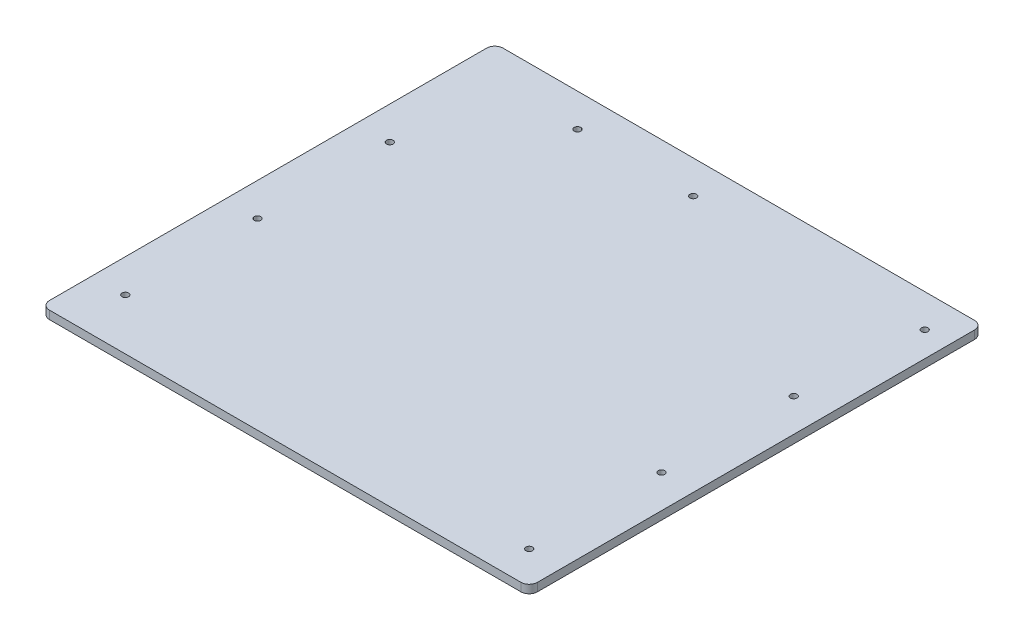
ISO-10303-21;
HEADER;
FILE_DESCRIPTION(('STEP AP214'),'2;1');
FILE_NAME('part.step','',(''),(''),'','','');
FILE_SCHEMA(('AUTOMOTIVE_DESIGN { 1 0 10303 214 1 1 1 1 }'));
ENDSEC;
DATA;
#1=APPLICATION_CONTEXT('core data for automotive mechanical design processes');
#2=APPLICATION_PROTOCOL_DEFINITION('international standard','automotive_design',2000,#1);
#3=PRODUCT_CONTEXT('',#1,'mechanical');
#4=PRODUCT('Part','Part','',(#3));
#5=PRODUCT_RELATED_PRODUCT_CATEGORY('part','',(#4));
#6=PRODUCT_DEFINITION_FORMATION('','',#4);
#7=PRODUCT_DEFINITION_CONTEXT('part definition',#1,'design');
#8=PRODUCT_DEFINITION('design','',#6,#7);
#9=PRODUCT_DEFINITION_SHAPE('','',#8);
#10=(LENGTH_UNIT() NAMED_UNIT(*) SI_UNIT(.MILLI.,.METRE.));
#11=(NAMED_UNIT(*) PLANE_ANGLE_UNIT() SI_UNIT($,.RADIAN.));
#12=(NAMED_UNIT(*) SI_UNIT($,.STERADIAN.) SOLID_ANGLE_UNIT());
#13=UNCERTAINTY_MEASURE_WITH_UNIT(LENGTH_MEASURE(1.E-05),#10,'distance_accuracy_value','');
#14=(GEOMETRIC_REPRESENTATION_CONTEXT(3) GLOBAL_UNCERTAINTY_ASSIGNED_CONTEXT((#13)) GLOBAL_UNIT_ASSIGNED_CONTEXT((#10,
#11,#12)) REPRESENTATION_CONTEXT('',''));
#15=CARTESIAN_POINT('',(0.,0.,0.));
#16=DIRECTION('',(0.,0.,1.));
#17=DIRECTION('',(1.,0.,0.));
#18=AXIS2_PLACEMENT_3D('',#15,#16,#17);
#19=CARTESIAN_POINT('',(0.,3.175,0.));
#20=DIRECTION('',(0.,-1.,0.));
#21=DIRECTION('',(0.,0.,-1.));
#22=AXIS2_PLACEMENT_3D('',#19,#20,#21);
#23=PLANE('',#22);
#24=CARTESIAN_POINT('',(81.0259999999996,3.175,-27.1779999999999));
#25=DIRECTION('',(0.,1.,0.));
#26=DIRECTION('',(0.,0.,1.));
#27=AXIS2_PLACEMENT_3D('',#24,#25,#26);
#28=CIRCLE('',#27,1.26999999999999);
#29=CARTESIAN_POINT('',(81.0259999999996,3.175,-25.9079999999999));
#30=VERTEX_POINT('',#29);
#31=EDGE_CURVE('E263',#30,#30,#28,.T.);
#32=ORIENTED_EDGE('',*,*,#31,.F.);
#33=EDGE_LOOP('',(#32));
#34=FACE_BOUND('',#33,.T.);
#35=CARTESIAN_POINT('',(81.026,3.175,74.4220000000001));
#36=DIRECTION('',(0.,1.,0.));
#37=DIRECTION('',(0.,0.,1.));
#38=AXIS2_PLACEMENT_3D('',#35,#36,#37);
#39=CIRCLE('',#38,1.26999999999999);
#40=CARTESIAN_POINT('',(81.026,3.175,75.6920000000001));
#41=VERTEX_POINT('',#40);
#42=EDGE_CURVE('E271',#41,#41,#39,.T.);
#43=ORIENTED_EDGE('',*,*,#42,.F.);
#44=EDGE_LOOP('',(#43));
#45=FACE_BOUND('',#44,.T.);
#46=CARTESIAN_POINT('',(81.0259999999998,3.175,23.6220000000001));
#47=DIRECTION('',(0.,1.,0.));
#48=DIRECTION('',(0.,0.,1.));
#49=AXIS2_PLACEMENT_3D('',#46,#47,#48);
#50=CIRCLE('',#49,1.26999999999999);
#51=CARTESIAN_POINT('',(81.0259999999998,3.175,24.8920000000001));
#52=VERTEX_POINT('',#51);
#53=EDGE_CURVE('E255',#52,#52,#50,.T.);
#54=ORIENTED_EDGE('',*,*,#53,.F.);
#55=EDGE_LOOP('',(#54));
#56=FACE_BOUND('',#55,.T.);
#57=DIRECTION('',(1.,0.,0.));
#58=VECTOR('',#57,1.);
#59=CARTESIAN_POINT('',(-93.726,3.175,87.122));
#60=LINE('',#59,#58);
#61=CARTESIAN_POINT('',(-90.551,3.175,87.122));
#62=VERTEX_POINT('',#61);
#63=CARTESIAN_POINT('',(90.551,3.175,87.122));
#64=VERTEX_POINT('',#63);
#65=EDGE_CURVE('E149',#62,#64,#60,.T.);
#66=ORIENTED_EDGE('',*,*,#65,.T.);
#67=CARTESIAN_POINT('',(90.551,3.175,83.947));
#68=DIRECTION('',(0.,-1.,0.));
#69=DIRECTION('',(0.,0.,-1.));
#70=AXIS2_PLACEMENT_3D('',#67,#68,#69);
#71=CIRCLE('',#70,3.175);
#72=CARTESIAN_POINT('',(93.726,3.175,83.947));
#73=VERTEX_POINT('',#72);
#74=EDGE_CURVE('E178',#64,#73,#71,.F.);
#75=ORIENTED_EDGE('',*,*,#74,.T.);
#76=DIRECTION('',(0.,0.,-1.));
#77=VECTOR('',#76,1.);
#78=CARTESIAN_POINT('',(93.726,3.175,87.122));
#79=LINE('',#78,#77);
#80=CARTESIAN_POINT('',(93.726,3.175,-83.947));
#81=VERTEX_POINT('',#80);
#82=EDGE_CURVE('E127',#73,#81,#79,.T.);
#83=ORIENTED_EDGE('',*,*,#82,.T.);
#84=CARTESIAN_POINT('',(90.551,3.175,-83.947));
#85=DIRECTION('',(0.,-1.,0.));
#86=DIRECTION('',(0.,0.,-1.));
#87=AXIS2_PLACEMENT_3D('',#84,#85,#86);
#88=CIRCLE('',#87,3.175);
#89=CARTESIAN_POINT('',(90.551,3.175,-87.122));
#90=VERTEX_POINT('',#89);
#91=EDGE_CURVE('E173',#81,#90,#88,.F.);
#92=ORIENTED_EDGE('',*,*,#91,.T.);
#93=DIRECTION('',(-1.,0.,0.));
#94=VECTOR('',#93,1.);
#95=CARTESIAN_POINT('',(-93.726,3.175,-87.122));
#96=LINE('',#95,#94);
#97=CARTESIAN_POINT('',(-90.551,3.175,-87.122));
#98=VERTEX_POINT('',#97);
#99=EDGE_CURVE('E193',#90,#98,#96,.T.);
#100=ORIENTED_EDGE('',*,*,#99,.T.);
#101=CARTESIAN_POINT('',(-90.551,3.175,-83.947));
#102=DIRECTION('',(0.,-1.,0.));
#103=DIRECTION('',(0.,0.,-1.));
#104=AXIS2_PLACEMENT_3D('',#101,#102,#103);
#105=CIRCLE('',#104,3.175);
#106=CARTESIAN_POINT('',(-93.726,3.175,-83.947));
#107=VERTEX_POINT('',#106);
#108=EDGE_CURVE('E62',#98,#107,#105,.F.);
#109=ORIENTED_EDGE('',*,*,#108,.T.);
#110=DIRECTION('',(0.,0.,1.));
#111=VECTOR('',#110,1.);
#112=CARTESIAN_POINT('',(-93.726,3.175,87.122));
#113=LINE('',#112,#111);
#114=CARTESIAN_POINT('',(-93.726,3.175,83.947));
#115=VERTEX_POINT('',#114);
#116=EDGE_CURVE('E201',#107,#115,#113,.T.);
#117=ORIENTED_EDGE('',*,*,#116,.T.);
#118=CARTESIAN_POINT('',(-90.551,3.175,83.947));
#119=DIRECTION('',(0.,-1.,0.));
#120=DIRECTION('',(0.,0.,-1.));
#121=AXIS2_PLACEMENT_3D('',#118,#119,#120);
#122=CIRCLE('',#121,3.175);
#123=EDGE_CURVE('E170',#115,#62,#122,.F.);
#124=ORIENTED_EDGE('',*,*,#123,.T.);
#125=EDGE_LOOP('',(#66,#75,#83,#92,#100,#109,#117,#124));
#126=FACE_BOUND('',#125,.T.);
#127=CARTESIAN_POINT('',(-81.026,3.175,67.49288));
#128=DIRECTION('',(0.,1.,0.));
#129=DIRECTION('',(0.,0.,1.));
#130=AXIS2_PLACEMENT_3D('',#127,#128,#129);
#131=CIRCLE('',#130,1.27000000000001);
#132=CARTESIAN_POINT('',(-81.026,3.175,68.76288));
#133=VERTEX_POINT('',#132);
#134=EDGE_CURVE('E138',#133,#133,#131,.T.);
#135=ORIENTED_EDGE('',*,*,#134,.F.);
#136=EDGE_LOOP('',(#135));
#137=FACE_BOUND('',#136,.T.);
#138=CARTESIAN_POINT('',(-4.82599999999998,3.175,-74.422));
#139=DIRECTION('',(0.,1.,0.));
#140=DIRECTION('',(0.,0.,1.));
#141=AXIS2_PLACEMENT_3D('',#138,#139,#140);
#142=CIRCLE('',#141,1.27);
#143=CARTESIAN_POINT('',(-4.82599999999998,3.175,-73.152));
#144=VERTEX_POINT('',#143);
#145=EDGE_CURVE('E213',#144,#144,#142,.T.);
#146=ORIENTED_EDGE('',*,*,#145,.F.);
#147=EDGE_LOOP('',(#146));
#148=FACE_BOUND('',#147,.T.);
#149=CARTESIAN_POINT('',(-81.0260000000002,3.175,16.69288));
#150=DIRECTION('',(0.,1.,0.));
#151=DIRECTION('',(0.,0.,1.));
#152=AXIS2_PLACEMENT_3D('',#149,#150,#151);
#153=CIRCLE('',#152,1.26999999999999);
#154=CARTESIAN_POINT('',(-81.0260000000002,3.175,17.96288));
#155=VERTEX_POINT('',#154);
#156=EDGE_CURVE('E219',#155,#155,#153,.T.);
#157=ORIENTED_EDGE('',*,*,#156,.F.);
#158=EDGE_LOOP('',(#157));
#159=FACE_BOUND('',#158,.T.);
#160=CARTESIAN_POINT('',(-81.0260000000003,3.175,-34.10712));
#161=DIRECTION('',(0.,1.,0.));
#162=DIRECTION('',(0.,0.,1.));
#163=AXIS2_PLACEMENT_3D('',#160,#161,#162);
#164=CIRCLE('',#163,1.26999999999999);
#165=CARTESIAN_POINT('',(-81.0260000000003,3.175,-32.83712));
#166=VERTEX_POINT('',#165);
#167=EDGE_CURVE('E227',#166,#166,#164,.T.);
#168=ORIENTED_EDGE('',*,*,#167,.F.);
#169=EDGE_LOOP('',(#168));
#170=FACE_BOUND('',#169,.T.);
#171=CARTESIAN_POINT('',(84.074,3.175,-74.422));
#172=DIRECTION('',(0.,1.,0.));
#173=DIRECTION('',(0.,0.,1.));
#174=AXIS2_PLACEMENT_3D('',#171,#172,#173);
#175=CIRCLE('',#174,1.26999999999999);
#176=CARTESIAN_POINT('',(84.074,3.175,-73.152));
#177=VERTEX_POINT('',#176);
#178=EDGE_CURVE('E235',#177,#177,#175,.T.);
#179=ORIENTED_EDGE('',*,*,#178,.F.);
#180=EDGE_LOOP('',(#179));
#181=FACE_BOUND('',#180,.T.);
#182=CARTESIAN_POINT('',(-49.276,3.175,-74.422));
#183=DIRECTION('',(0.,1.,0.));
#184=DIRECTION('',(0.,0.,1.));
#185=AXIS2_PLACEMENT_3D('',#182,#183,#184);
#186=CIRCLE('',#185,1.27);
#187=CARTESIAN_POINT('',(-49.276,3.175,-73.152));
#188=VERTEX_POINT('',#187);
#189=EDGE_CURVE('E243',#188,#188,#186,.T.);
#190=ORIENTED_EDGE('',*,*,#189,.F.);
#191=EDGE_LOOP('',(#190));
#192=FACE_BOUND('',#191,.T.);
#193=ADVANCED_FACE('F39',(#34,#45,#56,#126,#137,#148,#159,#170,#181,#192),#23,.F.);
#194=CARTESIAN_POINT('',(0.,0.,0.));
#195=DIRECTION('',(0.,-1.,0.));
#196=DIRECTION('',(0.,0.,-1.));
#197=AXIS2_PLACEMENT_3D('',#194,#195,#196);
#198=PLANE('',#197);
#199=CARTESIAN_POINT('',(81.0259999999996,0.,-27.1779999999999));
#200=DIRECTION('',(0.,1.,0.));
#201=DIRECTION('',(0.,0.,1.));
#202=AXIS2_PLACEMENT_3D('',#199,#200,#201);
#203=CIRCLE('',#202,1.26999999999999);
#204=CARTESIAN_POINT('',(81.0259999999996,0.,-25.9079999999999));
#205=VERTEX_POINT('',#204);
#206=EDGE_CURVE('E267',#205,#205,#203,.T.);
#207=ORIENTED_EDGE('',*,*,#206,.T.);
#208=EDGE_LOOP('',(#207));
#209=FACE_BOUND('',#208,.T.);
#210=CARTESIAN_POINT('',(81.026,0.,74.4220000000001));
#211=DIRECTION('',(0.,1.,0.));
#212=DIRECTION('',(0.,0.,1.));
#213=AXIS2_PLACEMENT_3D('',#210,#211,#212);
#214=CIRCLE('',#213,1.26999999999999);
#215=CARTESIAN_POINT('',(81.026,0.,75.6920000000001));
#216=VERTEX_POINT('',#215);
#217=EDGE_CURVE('E259',#216,#216,#214,.T.);
#218=ORIENTED_EDGE('',*,*,#217,.T.);
#219=EDGE_LOOP('',(#218));
#220=FACE_BOUND('',#219,.T.);
#221=CARTESIAN_POINT('',(81.0259999999998,0.,23.6220000000001));
#222=DIRECTION('',(0.,1.,0.));
#223=DIRECTION('',(0.,0.,1.));
#224=AXIS2_PLACEMENT_3D('',#221,#222,#223);
#225=CIRCLE('',#224,1.26999999999999);
#226=CARTESIAN_POINT('',(81.0259999999998,0.,24.8920000000001));
#227=VERTEX_POINT('',#226);
#228=EDGE_CURVE('E251',#227,#227,#225,.T.);
#229=ORIENTED_EDGE('',*,*,#228,.T.);
#230=EDGE_LOOP('',(#229));
#231=FACE_BOUND('',#230,.T.);
#232=CARTESIAN_POINT('',(84.074,0.,-74.422));
#233=DIRECTION('',(0.,1.,0.));
#234=DIRECTION('',(0.,0.,1.));
#235=AXIS2_PLACEMENT_3D('',#232,#233,#234);
#236=CIRCLE('',#235,1.26999999999999);
#237=CARTESIAN_POINT('',(84.074,0.,-73.152));
#238=VERTEX_POINT('',#237);
#239=EDGE_CURVE('E239',#238,#238,#236,.T.);
#240=ORIENTED_EDGE('',*,*,#239,.T.);
#241=EDGE_LOOP('',(#240));
#242=FACE_BOUND('',#241,.T.);
#243=CARTESIAN_POINT('',(-81.0260000000002,0.,16.69288));
#244=DIRECTION('',(0.,1.,0.));
#245=DIRECTION('',(0.,0.,1.));
#246=AXIS2_PLACEMENT_3D('',#243,#244,#245);
#247=CIRCLE('',#246,1.26999999999999);
#248=CARTESIAN_POINT('',(-81.0260000000002,0.,17.96288));
#249=VERTEX_POINT('',#248);
#250=EDGE_CURVE('E223',#249,#249,#247,.T.);
#251=ORIENTED_EDGE('',*,*,#250,.T.);
#252=EDGE_LOOP('',(#251));
#253=FACE_BOUND('',#252,.T.);
#254=CARTESIAN_POINT('',(-81.026,0.,67.49288));
#255=DIRECTION('',(0.,1.,0.));
#256=DIRECTION('',(0.,0.,1.));
#257=AXIS2_PLACEMENT_3D('',#254,#255,#256);
#258=CIRCLE('',#257,1.27000000000001);
#259=CARTESIAN_POINT('',(-81.026,0.,68.76288));
#260=VERTEX_POINT('',#259);
#261=EDGE_CURVE('E146',#260,#260,#258,.T.);
#262=ORIENTED_EDGE('',*,*,#261,.T.);
#263=EDGE_LOOP('',(#262));
#264=FACE_BOUND('',#263,.T.);
#265=DIRECTION('',(0.,0.,-1.));
#266=VECTOR('',#265,1.);
#267=CARTESIAN_POINT('',(93.726,0.,87.122));
#268=LINE('',#267,#266);
#269=CARTESIAN_POINT('',(93.726,0.,83.947));
#270=VERTEX_POINT('',#269);
#271=CARTESIAN_POINT('',(93.726,0.,-83.947));
#272=VERTEX_POINT('',#271);
#273=EDGE_CURVE('E124',#270,#272,#268,.T.);
#274=ORIENTED_EDGE('',*,*,#273,.F.);
#275=CARTESIAN_POINT('',(90.551,0.,83.947));
#276=DIRECTION('',(0.,-1.,0.));
#277=DIRECTION('',(0.,0.,-1.));
#278=AXIS2_PLACEMENT_3D('',#275,#276,#277);
#279=CIRCLE('',#278,3.175);
#280=CARTESIAN_POINT('',(90.551,0.,87.122));
#281=VERTEX_POINT('',#280);
#282=EDGE_CURVE('E106',#270,#281,#279,.T.);
#283=ORIENTED_EDGE('',*,*,#282,.T.);
#284=DIRECTION('',(1.,0.,0.));
#285=VECTOR('',#284,1.);
#286=CARTESIAN_POINT('',(-93.726,0.,87.122));
#287=LINE('',#286,#285);
#288=CARTESIAN_POINT('',(-90.551,0.,87.122));
#289=VERTEX_POINT('',#288);
#290=EDGE_CURVE('E154',#289,#281,#287,.T.);
#291=ORIENTED_EDGE('',*,*,#290,.F.);
#292=CARTESIAN_POINT('',(-90.551,0.,83.947));
#293=DIRECTION('',(0.,-1.,0.));
#294=DIRECTION('',(0.,0.,-1.));
#295=AXIS2_PLACEMENT_3D('',#292,#293,#294);
#296=CIRCLE('',#295,3.175);
#297=CARTESIAN_POINT('',(-93.726,0.,83.947));
#298=VERTEX_POINT('',#297);
#299=EDGE_CURVE('E129',#289,#298,#296,.T.);
#300=ORIENTED_EDGE('',*,*,#299,.T.);
#301=DIRECTION('',(0.,0.,1.));
#302=VECTOR('',#301,1.);
#303=CARTESIAN_POINT('',(-93.726,0.,87.122));
#304=LINE('',#303,#302);
#305=CARTESIAN_POINT('',(-93.726,0.,-83.947));
#306=VERTEX_POINT('',#305);
#307=EDGE_CURVE('E143',#306,#298,#304,.T.);
#308=ORIENTED_EDGE('',*,*,#307,.F.);
#309=CARTESIAN_POINT('',(-90.551,0.,-83.947));
#310=DIRECTION('',(0.,-1.,0.));
#311=DIRECTION('',(0.,0.,-1.));
#312=AXIS2_PLACEMENT_3D('',#309,#310,#311);
#313=CIRCLE('',#312,3.175);
#314=CARTESIAN_POINT('',(-90.551,0.,-87.122));
#315=VERTEX_POINT('',#314);
#316=EDGE_CURVE('E118',#306,#315,#313,.T.);
#317=ORIENTED_EDGE('',*,*,#316,.T.);
#318=DIRECTION('',(-1.,0.,0.));
#319=VECTOR('',#318,1.);
#320=CARTESIAN_POINT('',(-93.726,0.,-87.122));
#321=LINE('',#320,#319);
#322=CARTESIAN_POINT('',(90.551,0.,-87.122));
#323=VERTEX_POINT('',#322);
#324=EDGE_CURVE('E137',#323,#315,#321,.T.);
#325=ORIENTED_EDGE('',*,*,#324,.F.);
#326=CARTESIAN_POINT('',(90.551,0.,-83.947));
#327=DIRECTION('',(0.,-1.,0.));
#328=DIRECTION('',(0.,0.,-1.));
#329=AXIS2_PLACEMENT_3D('',#326,#327,#328);
#330=CIRCLE('',#329,3.175);
#331=EDGE_CURVE('E135',#323,#272,#330,.T.);
#332=ORIENTED_EDGE('',*,*,#331,.T.);
#333=EDGE_LOOP('',(#274,#283,#291,#300,#308,#317,#325,#332));
#334=FACE_BOUND('',#333,.T.);
#335=CARTESIAN_POINT('',(-4.82599999999998,0.,-74.422));
#336=DIRECTION('',(0.,1.,0.));
#337=DIRECTION('',(0.,0.,1.));
#338=AXIS2_PLACEMENT_3D('',#335,#336,#337);
#339=CIRCLE('',#338,1.27);
#340=CARTESIAN_POINT('',(-4.82599999999998,0.,-73.152));
#341=VERTEX_POINT('',#340);
#342=EDGE_CURVE('E215',#341,#341,#339,.T.);
#343=ORIENTED_EDGE('',*,*,#342,.T.);
#344=EDGE_LOOP('',(#343));
#345=FACE_BOUND('',#344,.T.);
#346=CARTESIAN_POINT('',(-81.0260000000003,0.,-34.10712));
#347=DIRECTION('',(0.,1.,0.));
#348=DIRECTION('',(0.,0.,1.));
#349=AXIS2_PLACEMENT_3D('',#346,#347,#348);
#350=CIRCLE('',#349,1.26999999999999);
#351=CARTESIAN_POINT('',(-81.0260000000003,0.,-32.83712));
#352=VERTEX_POINT('',#351);
#353=EDGE_CURVE('E231',#352,#352,#350,.T.);
#354=ORIENTED_EDGE('',*,*,#353,.T.);
#355=EDGE_LOOP('',(#354));
#356=FACE_BOUND('',#355,.T.);
#357=CARTESIAN_POINT('',(-49.276,0.,-74.422));
#358=DIRECTION('',(0.,1.,0.));
#359=DIRECTION('',(0.,0.,1.));
#360=AXIS2_PLACEMENT_3D('',#357,#358,#359);
#361=CIRCLE('',#360,1.27);
#362=CARTESIAN_POINT('',(-49.276,0.,-73.152));
#363=VERTEX_POINT('',#362);
#364=EDGE_CURVE('E247',#363,#363,#361,.T.);
#365=ORIENTED_EDGE('',*,*,#364,.T.);
#366=EDGE_LOOP('',(#365));
#367=FACE_BOUND('',#366,.T.);
#368=ADVANCED_FACE('F132',(#209,#220,#231,#242,#253,#264,#334,#345,#356,#367),#198,.T.);
#369=CARTESIAN_POINT('',(93.726,3.175,87.122));
#370=DIRECTION('',(-1.,0.,0.));
#371=DIRECTION('',(0.,0.,1.));
#372=AXIS2_PLACEMENT_3D('',#369,#370,#371);
#373=PLANE('',#372);
#374=ORIENTED_EDGE('',*,*,#82,.F.);
#375=DIRECTION('',(0.,-1.,0.));
#376=VECTOR('',#375,1.);
#377=CARTESIAN_POINT('',(93.726,3.175,83.947));
#378=LINE('',#377,#376);
#379=EDGE_CURVE('E110',#73,#270,#378,.T.);
#380=ORIENTED_EDGE('',*,*,#379,.T.);
#381=ORIENTED_EDGE('',*,*,#273,.T.);
#382=DIRECTION('',(0.,-1.,0.));
#383=VECTOR('',#382,1.);
#384=CARTESIAN_POINT('',(93.726,3.175,-83.947));
#385=LINE('',#384,#383);
#386=EDGE_CURVE('E130',#272,#81,#385,.F.);
#387=ORIENTED_EDGE('',*,*,#386,.T.);
#388=EDGE_LOOP('',(#374,#380,#381,#387));
#389=FACE_BOUND('',#388,.T.);
#390=ADVANCED_FACE('F123',(#389),#373,.F.);
#391=CARTESIAN_POINT('',(-93.726,3.175,-87.122));
#392=DIRECTION('',(0.,0.,1.));
#393=DIRECTION('',(1.,0.,0.));
#394=AXIS2_PLACEMENT_3D('',#391,#392,#393);
#395=PLANE('',#394);
#396=ORIENTED_EDGE('',*,*,#324,.T.);
#397=DIRECTION('',(0.,-1.,0.));
#398=VECTOR('',#397,1.);
#399=CARTESIAN_POINT('',(-90.551,3.175,-87.122));
#400=LINE('',#399,#398);
#401=EDGE_CURVE('E11',#315,#98,#400,.F.);
#402=ORIENTED_EDGE('',*,*,#401,.T.);
#403=ORIENTED_EDGE('',*,*,#99,.F.);
#404=DIRECTION('',(0.,-1.,0.));
#405=VECTOR('',#404,1.);
#406=CARTESIAN_POINT('',(90.551,3.175,-87.122));
#407=LINE('',#406,#405);
#408=EDGE_CURVE('E48',#90,#323,#407,.T.);
#409=ORIENTED_EDGE('',*,*,#408,.T.);
#410=EDGE_LOOP('',(#396,#402,#403,#409));
#411=FACE_BOUND('',#410,.T.);
#412=ADVANCED_FACE('F191',(#411),#395,.F.);
#413=CARTESIAN_POINT('',(-93.726,3.175,87.122));
#414=DIRECTION('',(1.,0.,0.));
#415=DIRECTION('',(0.,0.,-1.));
#416=AXIS2_PLACEMENT_3D('',#413,#414,#415);
#417=PLANE('',#416);
#418=ORIENTED_EDGE('',*,*,#116,.F.);
#419=DIRECTION('',(0.,-1.,0.));
#420=VECTOR('',#419,1.);
#421=CARTESIAN_POINT('',(-93.726,3.175,-83.947));
#422=LINE('',#421,#420);
#423=EDGE_CURVE('E183',#107,#306,#422,.T.);
#424=ORIENTED_EDGE('',*,*,#423,.T.);
#425=ORIENTED_EDGE('',*,*,#307,.T.);
#426=DIRECTION('',(0.,-1.,0.));
#427=VECTOR('',#426,1.);
#428=CARTESIAN_POINT('',(-93.726,3.175,83.947));
#429=LINE('',#428,#427);
#430=EDGE_CURVE('E55',#298,#115,#429,.F.);
#431=ORIENTED_EDGE('',*,*,#430,.T.);
#432=EDGE_LOOP('',(#418,#424,#425,#431));
#433=FACE_BOUND('',#432,.T.);
#434=ADVANCED_FACE('F200',(#433),#417,.F.);
#435=CARTESIAN_POINT('',(-93.726,3.175,87.122));
#436=DIRECTION('',(0.,0.,-1.));
#437=DIRECTION('',(-1.,0.,0.));
#438=AXIS2_PLACEMENT_3D('',#435,#436,#437);
#439=PLANE('',#438);
#440=ORIENTED_EDGE('',*,*,#290,.T.);
#441=DIRECTION('',(0.,-1.,0.));
#442=VECTOR('',#441,1.);
#443=CARTESIAN_POINT('',(90.551,3.175,87.122));
#444=LINE('',#443,#442);
#445=EDGE_CURVE('E111',#281,#64,#444,.F.);
#446=ORIENTED_EDGE('',*,*,#445,.T.);
#447=ORIENTED_EDGE('',*,*,#65,.F.);
#448=DIRECTION('',(0.,-1.,0.));
#449=VECTOR('',#448,1.);
#450=CARTESIAN_POINT('',(-90.551,3.175,87.122));
#451=LINE('',#450,#449);
#452=EDGE_CURVE('E117',#62,#289,#451,.T.);
#453=ORIENTED_EDGE('',*,*,#452,.T.);
#454=EDGE_LOOP('',(#440,#446,#447,#453));
#455=FACE_BOUND('',#454,.T.);
#456=ADVANCED_FACE('F324',(#455),#439,.F.);
#457=CARTESIAN_POINT('',(-81.026,3.175,67.49288));
#458=DIRECTION('',(0.,-1.,0.));
#459=DIRECTION('',(0.,0.,-1.));
#460=AXIS2_PLACEMENT_3D('',#457,#458,#459);
#461=CYLINDRICAL_SURFACE('',#460,1.27000000000001);
#462=ORIENTED_EDGE('',*,*,#134,.T.);
#463=EDGE_LOOP('',(#462));
#464=FACE_BOUND('',#463,.T.);
#465=ORIENTED_EDGE('',*,*,#261,.F.);
#466=EDGE_LOOP('',(#465));
#467=FACE_BOUND('',#466,.T.);
#468=ADVANCED_FACE('F327',(#464,#467),#461,.F.);
#469=CARTESIAN_POINT('',(-4.82599999999998,3.175,-74.422));
#470=DIRECTION('',(0.,-1.,0.));
#471=DIRECTION('',(0.,0.,-1.));
#472=AXIS2_PLACEMENT_3D('',#469,#470,#471);
#473=CYLINDRICAL_SURFACE('',#472,1.27);
#474=ORIENTED_EDGE('',*,*,#145,.T.);
#475=EDGE_LOOP('',(#474));
#476=FACE_BOUND('',#475,.T.);
#477=ORIENTED_EDGE('',*,*,#342,.F.);
#478=EDGE_LOOP('',(#477));
#479=FACE_BOUND('',#478,.T.);
#480=ADVANCED_FACE('F449',(#476,#479),#473,.F.);
#481=CARTESIAN_POINT('',(-81.0260000000002,3.175,16.69288));
#482=DIRECTION('',(0.,-1.,0.));
#483=DIRECTION('',(0.,0.,-1.));
#484=AXIS2_PLACEMENT_3D('',#481,#482,#483);
#485=CYLINDRICAL_SURFACE('',#484,1.26999999999999);
#486=ORIENTED_EDGE('',*,*,#156,.T.);
#487=EDGE_LOOP('',(#486));
#488=FACE_BOUND('',#487,.T.);
#489=ORIENTED_EDGE('',*,*,#250,.F.);
#490=EDGE_LOOP('',(#489));
#491=FACE_BOUND('',#490,.T.);
#492=ADVANCED_FACE('F439',(#488,#491),#485,.F.);
#493=CARTESIAN_POINT('',(-81.0260000000003,3.175,-34.10712));
#494=DIRECTION('',(0.,-1.,0.));
#495=DIRECTION('',(0.,0.,-1.));
#496=AXIS2_PLACEMENT_3D('',#493,#494,#495);
#497=CYLINDRICAL_SURFACE('',#496,1.26999999999999);
#498=ORIENTED_EDGE('',*,*,#167,.T.);
#499=EDGE_LOOP('',(#498));
#500=FACE_BOUND('',#499,.T.);
#501=ORIENTED_EDGE('',*,*,#353,.F.);
#502=EDGE_LOOP('',(#501));
#503=FACE_BOUND('',#502,.T.);
#504=ADVANCED_FACE('F429',(#500,#503),#497,.F.);
#505=CARTESIAN_POINT('',(84.074,3.175,-74.422));
#506=DIRECTION('',(0.,-1.,0.));
#507=DIRECTION('',(0.,0.,-1.));
#508=AXIS2_PLACEMENT_3D('',#505,#506,#507);
#509=CYLINDRICAL_SURFACE('',#508,1.26999999999999);
#510=ORIENTED_EDGE('',*,*,#178,.T.);
#511=EDGE_LOOP('',(#510));
#512=FACE_BOUND('',#511,.T.);
#513=ORIENTED_EDGE('',*,*,#239,.F.);
#514=EDGE_LOOP('',(#513));
#515=FACE_BOUND('',#514,.T.);
#516=ADVANCED_FACE('F311',(#512,#515),#509,.F.);
#517=CARTESIAN_POINT('',(-49.276,3.175,-74.422));
#518=DIRECTION('',(0.,-1.,0.));
#519=DIRECTION('',(0.,0.,-1.));
#520=AXIS2_PLACEMENT_3D('',#517,#518,#519);
#521=CYLINDRICAL_SURFACE('',#520,1.27);
#522=ORIENTED_EDGE('',*,*,#189,.T.);
#523=EDGE_LOOP('',(#522));
#524=FACE_BOUND('',#523,.T.);
#525=ORIENTED_EDGE('',*,*,#364,.F.);
#526=EDGE_LOOP('',(#525));
#527=FACE_BOUND('',#526,.T.);
#528=ADVANCED_FACE('F308',(#524,#527),#521,.F.);
#529=CARTESIAN_POINT('',(81.0259999999998,0.,23.6220000000001));
#530=DIRECTION('',(0.,1.,0.));
#531=DIRECTION('',(0.,0.,1.));
#532=AXIS2_PLACEMENT_3D('',#529,#530,#531);
#533=CYLINDRICAL_SURFACE('',#532,1.26999999999999);
#534=ORIENTED_EDGE('',*,*,#228,.F.);
#535=EDGE_LOOP('',(#534));
#536=FACE_BOUND('',#535,.T.);
#537=ORIENTED_EDGE('',*,*,#53,.T.);
#538=EDGE_LOOP('',(#537));
#539=FACE_BOUND('',#538,.T.);
#540=ADVANCED_FACE('F285',(#536,#539),#533,.F.);
#541=CARTESIAN_POINT('',(81.026,0.,74.4220000000001));
#542=DIRECTION('',(0.,1.,0.));
#543=DIRECTION('',(0.,0.,1.));
#544=AXIS2_PLACEMENT_3D('',#541,#542,#543);
#545=CYLINDRICAL_SURFACE('',#544,1.26999999999999);
#546=ORIENTED_EDGE('',*,*,#217,.F.);
#547=EDGE_LOOP('',(#546));
#548=FACE_BOUND('',#547,.T.);
#549=ORIENTED_EDGE('',*,*,#42,.T.);
#550=EDGE_LOOP('',(#549));
#551=FACE_BOUND('',#550,.T.);
#552=ADVANCED_FACE('F281',(#548,#551),#545,.F.);
#553=CARTESIAN_POINT('',(81.0259999999996,0.,-27.1779999999999));
#554=DIRECTION('',(0.,1.,0.));
#555=DIRECTION('',(0.,0.,1.));
#556=AXIS2_PLACEMENT_3D('',#553,#554,#555);
#557=CYLINDRICAL_SURFACE('',#556,1.26999999999999);
#558=ORIENTED_EDGE('',*,*,#206,.F.);
#559=EDGE_LOOP('',(#558));
#560=FACE_BOUND('',#559,.T.);
#561=ORIENTED_EDGE('',*,*,#31,.T.);
#562=EDGE_LOOP('',(#561));
#563=FACE_BOUND('',#562,.T.);
#564=ADVANCED_FACE('F284',(#560,#563),#557,.F.);
#565=CARTESIAN_POINT('',(90.551,3.175,83.947));
#566=DIRECTION('',(0.,-1.,0.));
#567=DIRECTION('',(0.,0.,-1.));
#568=AXIS2_PLACEMENT_3D('',#565,#566,#567);
#569=CYLINDRICAL_SURFACE('',#568,3.175);
#570=ORIENTED_EDGE('',*,*,#74,.F.);
#571=ORIENTED_EDGE('',*,*,#445,.F.);
#572=ORIENTED_EDGE('',*,*,#282,.F.);
#573=ORIENTED_EDGE('',*,*,#379,.F.);
#574=EDGE_LOOP('',(#570,#571,#572,#573));
#575=FACE_BOUND('',#574,.T.);
#576=ADVANCED_FACE('F109',(#575),#569,.T.);
#577=CARTESIAN_POINT('',(-90.551,3.175,-83.947));
#578=DIRECTION('',(0.,-1.,0.));
#579=DIRECTION('',(0.,0.,-1.));
#580=AXIS2_PLACEMENT_3D('',#577,#578,#579);
#581=CYLINDRICAL_SURFACE('',#580,3.175);
#582=ORIENTED_EDGE('',*,*,#108,.F.);
#583=ORIENTED_EDGE('',*,*,#401,.F.);
#584=ORIENTED_EDGE('',*,*,#316,.F.);
#585=ORIENTED_EDGE('',*,*,#423,.F.);
#586=EDGE_LOOP('',(#582,#583,#584,#585));
#587=FACE_BOUND('',#586,.T.);
#588=ADVANCED_FACE('F199',(#587),#581,.T.);
#589=CARTESIAN_POINT('',(90.551,3.175,-83.947));
#590=DIRECTION('',(0.,-1.,0.));
#591=DIRECTION('',(0.,0.,-1.));
#592=AXIS2_PLACEMENT_3D('',#589,#590,#591);
#593=CYLINDRICAL_SURFACE('',#592,3.175);
#594=ORIENTED_EDGE('',*,*,#91,.F.);
#595=ORIENTED_EDGE('',*,*,#386,.F.);
#596=ORIENTED_EDGE('',*,*,#331,.F.);
#597=ORIENTED_EDGE('',*,*,#408,.F.);
#598=EDGE_LOOP('',(#594,#595,#596,#597));
#599=FACE_BOUND('',#598,.T.);
#600=ADVANCED_FACE('F336',(#599),#593,.T.);
#601=CARTESIAN_POINT('',(-90.551,3.175,83.947));
#602=DIRECTION('',(0.,-1.,0.));
#603=DIRECTION('',(0.,0.,-1.));
#604=AXIS2_PLACEMENT_3D('',#601,#602,#603);
#605=CYLINDRICAL_SURFACE('',#604,3.175);
#606=ORIENTED_EDGE('',*,*,#123,.F.);
#607=ORIENTED_EDGE('',*,*,#430,.F.);
#608=ORIENTED_EDGE('',*,*,#299,.F.);
#609=ORIENTED_EDGE('',*,*,#452,.F.);
#610=EDGE_LOOP('',(#606,#607,#608,#609));
#611=FACE_BOUND('',#610,.T.);
#612=ADVANCED_FACE('F41',(#611),#605,.T.);
#613=CLOSED_SHELL('',(#193,#368,#390,#412,#434,#456,#468,#480,#492,#504,#516,#528,#540,#552,
#564,#576,#588,#600,#612));
#614=MANIFOLD_SOLID_BREP('B2',#613);
#615=ADVANCED_BREP_SHAPE_REPRESENTATION('',(#18,#614),#14);
#616=SHAPE_DEFINITION_REPRESENTATION(#9,#615);
ENDSEC;
END-ISO-10303-21;
